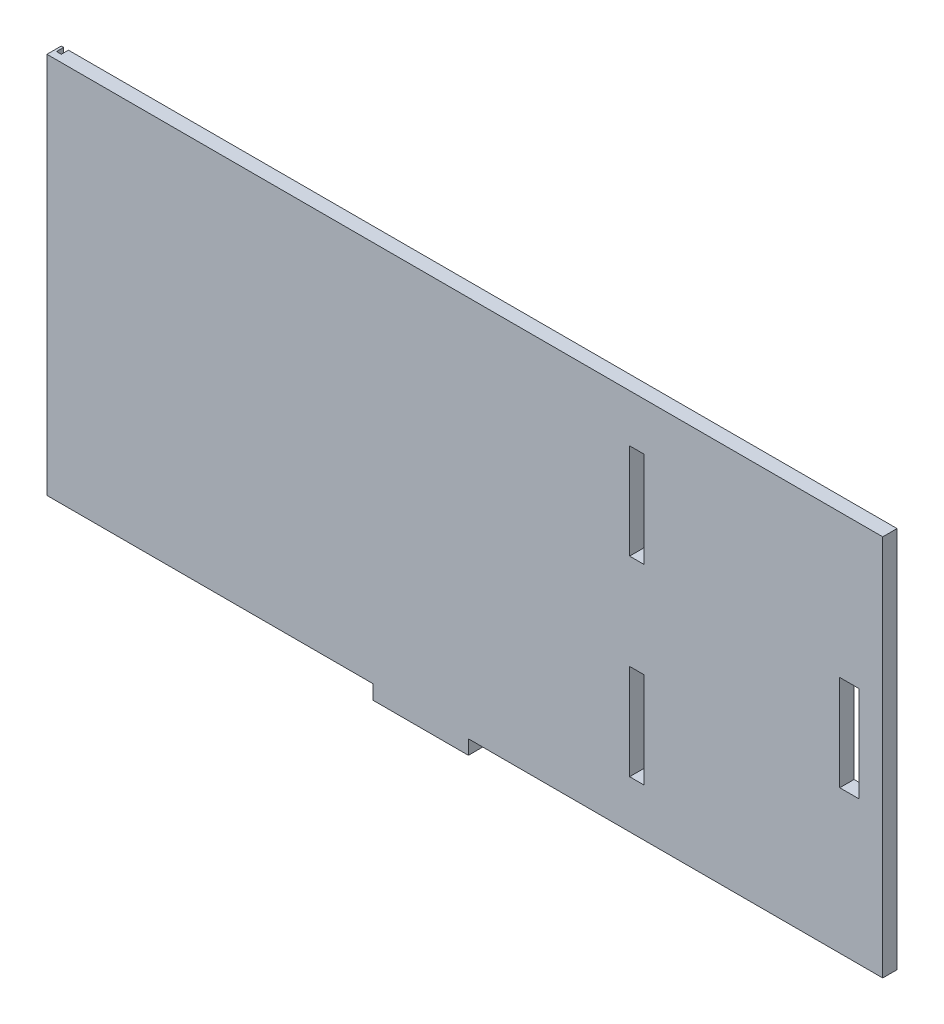
ISO-10303-21;
HEADER;
FILE_DESCRIPTION(('STEP AP214'),'2;1');
FILE_NAME('part.step','',(''),(''),'','','');
FILE_SCHEMA(('AUTOMOTIVE_DESIGN { 1 0 10303 214 1 1 1 1 }'));
ENDSEC;
DATA;
#1=APPLICATION_CONTEXT('core data for automotive mechanical design processes');
#2=APPLICATION_PROTOCOL_DEFINITION('international standard','automotive_design',2000,#1);
#3=PRODUCT_CONTEXT('',#1,'mechanical');
#4=PRODUCT('Part','Part','',(#3));
#5=PRODUCT_RELATED_PRODUCT_CATEGORY('part','',(#4));
#6=PRODUCT_DEFINITION_FORMATION('','',#4);
#7=PRODUCT_DEFINITION_CONTEXT('part definition',#1,'design');
#8=PRODUCT_DEFINITION('design','',#6,#7);
#9=PRODUCT_DEFINITION_SHAPE('','',#8);
#10=(LENGTH_UNIT() NAMED_UNIT(*) SI_UNIT(.MILLI.,.METRE.));
#11=(NAMED_UNIT(*) PLANE_ANGLE_UNIT() SI_UNIT($,.RADIAN.));
#12=(NAMED_UNIT(*) SI_UNIT($,.STERADIAN.) SOLID_ANGLE_UNIT());
#13=UNCERTAINTY_MEASURE_WITH_UNIT(LENGTH_MEASURE(1.E-05),#10,'distance_accuracy_value','');
#14=(GEOMETRIC_REPRESENTATION_CONTEXT(3) GLOBAL_UNCERTAINTY_ASSIGNED_CONTEXT((#13)) GLOBAL_UNIT_ASSIGNED_CONTEXT((#10,
#11,#12)) REPRESENTATION_CONTEXT('',''));
#15=CARTESIAN_POINT('',(0.,0.,0.));
#16=DIRECTION('',(0.,0.,1.));
#17=DIRECTION('',(1.,0.,0.));
#18=AXIS2_PLACEMENT_3D('',#15,#16,#17);
#19=CARTESIAN_POINT('',(0.,-80.,3.));
#20=DIRECTION('',(0.,1.,0.));
#21=DIRECTION('',(0.,0.,1.));
#22=AXIS2_PLACEMENT_3D('',#19,#20,#21);
#23=PLANE('',#22);
#24=DIRECTION('',(0.,0.,1.));
#25=VECTOR('',#24,1.);
#26=CARTESIAN_POINT('',(-86.75,-80.,0.));
#27=LINE('',#26,#25);
#28=CARTESIAN_POINT('',(-86.75,-80.,0.));
#29=VERTEX_POINT('',#28);
#30=CARTESIAN_POINT('',(-86.75,-80.,3.));
#31=VERTEX_POINT('',#30);
#32=EDGE_CURVE('E237',#29,#31,#27,.T.);
#33=ORIENTED_EDGE('',*,*,#32,.F.);
#34=DIRECTION('',(1.,0.,0.));
#35=VECTOR('',#34,1.);
#36=CARTESIAN_POINT('',(0.,-80.,0.));
#37=LINE('',#36,#35);
#38=CARTESIAN_POINT('',(0.,-80.,0.));
#39=VERTEX_POINT('',#38);
#40=EDGE_CURVE('E375',#29,#39,#37,.T.);
#41=ORIENTED_EDGE('',*,*,#40,.T.);
#42=DIRECTION('',(0.,0.,-1.));
#43=VECTOR('',#42,1.);
#44=CARTESIAN_POINT('',(0.,-80.,3.));
#45=LINE('',#44,#43);
#46=CARTESIAN_POINT('',(0.,-80.,3.));
#47=VERTEX_POINT('',#46);
#48=EDGE_CURVE('E366',#47,#39,#45,.T.);
#49=ORIENTED_EDGE('',*,*,#48,.F.);
#50=DIRECTION('',(1.,0.,0.));
#51=VECTOR('',#50,1.);
#52=CARTESIAN_POINT('',(0.,-80.,3.));
#53=LINE('',#52,#51);
#54=EDGE_CURVE('E362',#31,#47,#53,.T.);
#55=ORIENTED_EDGE('',*,*,#54,.F.);
#56=EDGE_LOOP('',(#33,#41,#49,#55));
#57=FACE_BOUND('',#56,.T.);
#58=ADVANCED_FACE('F39',(#57),#23,.F.);
#59=DIRECTION('',(0.,0.,-1.));
#60=VECTOR('',#59,1.);
#61=CARTESIAN_POINT('',(-106.75,-80.,0.));
#62=LINE('',#61,#60);
#63=CARTESIAN_POINT('',(-106.75,-80.,3.));
#64=VERTEX_POINT('',#63);
#65=CARTESIAN_POINT('',(-106.75,-80.,0.));
#66=VERTEX_POINT('',#65);
#67=EDGE_CURVE('E242',#64,#66,#62,.T.);
#68=ORIENTED_EDGE('',*,*,#67,.F.);
#69=CARTESIAN_POINT('',(-175.,-80.,3.));
#70=VERTEX_POINT('',#69);
#71=EDGE_CURVE('E363',#70,#64,#53,.T.);
#72=ORIENTED_EDGE('',*,*,#71,.F.);
#73=DIRECTION('',(0.,0.,-1.));
#74=VECTOR('',#73,1.);
#75=CARTESIAN_POINT('',(-175.,-80.,3.));
#76=LINE('',#75,#74);
#77=CARTESIAN_POINT('',(-175.,-80.,0.));
#78=VERTEX_POINT('',#77);
#79=EDGE_CURVE('E381',#70,#78,#76,.T.);
#80=ORIENTED_EDGE('',*,*,#79,.T.);
#81=CARTESIAN_POINT('',(-174.5,-80.,0.));
#82=VERTEX_POINT('',#81);
#83=EDGE_CURVE('E358',#78,#82,#37,.T.);
#84=ORIENTED_EDGE('',*,*,#83,.T.);
#85=DIRECTION('',(0.,0.,-1.));
#86=VECTOR('',#85,1.);
#87=CARTESIAN_POINT('',(-174.5,-80.,0.));
#88=LINE('',#87,#86);
#89=CARTESIAN_POINT('',(-174.5,-80.,1.5));
#90=VERTEX_POINT('',#89);
#91=EDGE_CURVE('E267',#90,#82,#88,.T.);
#92=ORIENTED_EDGE('',*,*,#91,.F.);
#93=DIRECTION('',(-1.,0.,0.));
#94=VECTOR('',#93,1.);
#95=CARTESIAN_POINT('',(-174.5,-80.,1.5));
#96=LINE('',#95,#94);
#97=CARTESIAN_POINT('',(-173.5,-80.,1.5));
#98=VERTEX_POINT('',#97);
#99=EDGE_CURVE('E280',#98,#90,#96,.T.);
#100=ORIENTED_EDGE('',*,*,#99,.F.);
#101=DIRECTION('',(0.,0.,1.));
#102=VECTOR('',#101,1.);
#103=CARTESIAN_POINT('',(-173.5,-80.,0.));
#104=LINE('',#103,#102);
#105=CARTESIAN_POINT('',(-173.5,-80.,0.));
#106=VERTEX_POINT('',#105);
#107=EDGE_CURVE('E264',#106,#98,#104,.T.);
#108=ORIENTED_EDGE('',*,*,#107,.F.);
#109=EDGE_CURVE('E378',#106,#66,#37,.T.);
#110=ORIENTED_EDGE('',*,*,#109,.T.);
#111=EDGE_LOOP('',(#68,#72,#80,#84,#92,#100,#108,#110));
#112=FACE_BOUND('',#111,.T.);
#113=ADVANCED_FACE('F398',(#112),#23,.F.);
#114=CARTESIAN_POINT('',(0.,0.,0.));
#115=DIRECTION('',(0.,0.,-1.));
#116=DIRECTION('',(-1.,0.,0.));
#117=AXIS2_PLACEMENT_3D('',#114,#115,#116);
#118=PLANE('',#117);
#119=DIRECTION('',(0.,1.,0.));
#120=VECTOR('',#119,1.);
#121=CARTESIAN_POINT('',(-174.5,-80.001,0.));
#122=LINE('',#121,#120);
#123=CARTESIAN_POINT('',(-174.5,0.,0.));
#124=VERTEX_POINT('',#123);
#125=EDGE_CURVE('E278',#82,#124,#122,.T.);
#126=ORIENTED_EDGE('',*,*,#125,.F.);
#127=ORIENTED_EDGE('',*,*,#83,.F.);
#128=DIRECTION('',(0.,-1.,0.));
#129=VECTOR('',#128,1.);
#130=CARTESIAN_POINT('',(-175.,0.,0.));
#131=LINE('',#130,#129);
#132=CARTESIAN_POINT('',(-175.,0.,0.));
#133=VERTEX_POINT('',#132);
#134=EDGE_CURVE('E373',#133,#78,#131,.T.);
#135=ORIENTED_EDGE('',*,*,#134,.F.);
#136=DIRECTION('',(-1.,0.,0.));
#137=VECTOR('',#136,1.);
#138=CARTESIAN_POINT('',(0.,0.,0.));
#139=LINE('',#138,#137);
#140=EDGE_CURVE('E369',#124,#133,#139,.T.);
#141=ORIENTED_EDGE('',*,*,#140,.F.);
#142=EDGE_LOOP('',(#126,#127,#135,#141));
#143=FACE_BOUND('',#142,.T.);
#144=ADVANCED_FACE('F395',(#143),#118,.T.);
#145=CARTESIAN_POINT('',(0.,0.,3.));
#146=DIRECTION('',(-1.,0.,0.));
#147=DIRECTION('',(0.,0.,1.));
#148=AXIS2_PLACEMENT_3D('',#145,#146,#147);
#149=PLANE('',#148);
#150=DIRECTION('',(0.,1.,0.));
#151=VECTOR('',#150,1.);
#152=CARTESIAN_POINT('',(0.,0.,0.));
#153=LINE('',#152,#151);
#154=CARTESIAN_POINT('',(0.,0.,0.));
#155=VERTEX_POINT('',#154);
#156=EDGE_CURVE('E323',#39,#155,#153,.T.);
#157=ORIENTED_EDGE('',*,*,#156,.T.);
#158=DIRECTION('',(0.,0.,-1.));
#159=VECTOR('',#158,1.);
#160=CARTESIAN_POINT('',(0.,0.,3.));
#161=LINE('',#160,#159);
#162=CARTESIAN_POINT('',(0.,0.,3.));
#163=VERTEX_POINT('',#162);
#164=EDGE_CURVE('E11',#163,#155,#161,.T.);
#165=ORIENTED_EDGE('',*,*,#164,.F.);
#166=DIRECTION('',(0.,1.,0.));
#167=VECTOR('',#166,1.);
#168=CARTESIAN_POINT('',(0.,0.,3.));
#169=LINE('',#168,#167);
#170=EDGE_CURVE('E354',#47,#163,#169,.T.);
#171=ORIENTED_EDGE('',*,*,#170,.F.);
#172=ORIENTED_EDGE('',*,*,#48,.T.);
#173=EDGE_LOOP('',(#157,#165,#171,#172));
#174=FACE_BOUND('',#173,.T.);
#175=ADVANCED_FACE('F41',(#174),#149,.F.);
#176=CARTESIAN_POINT('',(0.,0.,3.));
#177=DIRECTION('',(0.,-1.,0.));
#178=DIRECTION('',(0.,0.,-1.));
#179=AXIS2_PLACEMENT_3D('',#176,#177,#178);
#180=PLANE('',#179);
#181=DIRECTION('',(1.,0.,0.));
#182=VECTOR('',#181,1.);
#183=CARTESIAN_POINT('',(-174.5,0.,1.5));
#184=LINE('',#183,#182);
#185=CARTESIAN_POINT('',(-174.5,0.,1.5));
#186=VERTEX_POINT('',#185);
#187=CARTESIAN_POINT('',(-173.5,0.,1.5));
#188=VERTEX_POINT('',#187);
#189=EDGE_CURVE('E272',#186,#188,#184,.T.);
#190=ORIENTED_EDGE('',*,*,#189,.F.);
#191=DIRECTION('',(0.,0.,1.));
#192=VECTOR('',#191,1.);
#193=CARTESIAN_POINT('',(-174.5,0.,0.));
#194=LINE('',#193,#192);
#195=EDGE_CURVE('E269',#124,#186,#194,.T.);
#196=ORIENTED_EDGE('',*,*,#195,.F.);
#197=ORIENTED_EDGE('',*,*,#140,.T.);
#198=DIRECTION('',(0.,0.,-1.));
#199=VECTOR('',#198,1.);
#200=CARTESIAN_POINT('',(-175.,0.,3.));
#201=LINE('',#200,#199);
#202=CARTESIAN_POINT('',(-175.,0.,3.));
#203=VERTEX_POINT('',#202);
#204=EDGE_CURVE('E47',#203,#133,#201,.T.);
#205=ORIENTED_EDGE('',*,*,#204,.F.);
#206=DIRECTION('',(-1.,0.,0.));
#207=VECTOR('',#206,1.);
#208=CARTESIAN_POINT('',(0.,0.,3.));
#209=LINE('',#208,#207);
#210=EDGE_CURVE('E357',#163,#203,#209,.T.);
#211=ORIENTED_EDGE('',*,*,#210,.F.);
#212=ORIENTED_EDGE('',*,*,#164,.T.);
#213=CARTESIAN_POINT('',(-173.5,0.,0.));
#214=VERTEX_POINT('',#213);
#215=EDGE_CURVE('E370',#155,#214,#139,.T.);
#216=ORIENTED_EDGE('',*,*,#215,.T.);
#217=DIRECTION('',(0.,0.,-1.));
#218=VECTOR('',#217,1.);
#219=CARTESIAN_POINT('',(-173.5,0.,0.));
#220=LINE('',#219,#218);
#221=EDGE_CURVE('E275',#188,#214,#220,.T.);
#222=ORIENTED_EDGE('',*,*,#221,.F.);
#223=EDGE_LOOP('',(#190,#196,#197,#205,#211,#212,#216,#222));
#224=FACE_BOUND('',#223,.T.);
#225=ADVANCED_FACE('F426',(#224),#180,.F.);
#226=CARTESIAN_POINT('',(-175.,0.,3.));
#227=DIRECTION('',(1.,0.,0.));
#228=DIRECTION('',(0.,0.,-1.));
#229=AXIS2_PLACEMENT_3D('',#226,#227,#228);
#230=PLANE('',#229);
#231=ORIENTED_EDGE('',*,*,#134,.T.);
#232=ORIENTED_EDGE('',*,*,#79,.F.);
#233=DIRECTION('',(0.,-1.,0.));
#234=VECTOR('',#233,1.);
#235=CARTESIAN_POINT('',(-175.,0.,3.));
#236=LINE('',#235,#234);
#237=EDGE_CURVE('E360',#203,#70,#236,.T.);
#238=ORIENTED_EDGE('',*,*,#237,.F.);
#239=ORIENTED_EDGE('',*,*,#204,.T.);
#240=EDGE_LOOP('',(#231,#232,#238,#239));
#241=FACE_BOUND('',#240,.T.);
#242=ADVANCED_FACE('F388',(#241),#230,.F.);
#243=CARTESIAN_POINT('',(0.,0.,3.));
#244=DIRECTION('',(0.,0.,-1.));
#245=DIRECTION('',(-1.,0.,0.));
#246=AXIS2_PLACEMENT_3D('',#243,#244,#245);
#247=PLANE('',#246);
#248=DIRECTION('',(1.,0.,0.));
#249=VECTOR('',#248,1.);
#250=CARTESIAN_POINT('',(0.,-30.,3.));
#251=LINE('',#250,#249);
#252=CARTESIAN_POINT('',(-9.,-30.,3.));
#253=VERTEX_POINT('',#252);
#254=CARTESIAN_POINT('',(-5.,-30.,3.));
#255=VERTEX_POINT('',#254);
#256=EDGE_CURVE('E231',#253,#255,#251,.T.);
#257=ORIENTED_EDGE('',*,*,#256,.T.);
#258=DIRECTION('',(0.,-1.,0.));
#259=VECTOR('',#258,1.);
#260=CARTESIAN_POINT('',(-5.,0.,3.));
#261=LINE('',#260,#259);
#262=CARTESIAN_POINT('',(-5.,-50.,3.));
#263=VERTEX_POINT('',#262);
#264=EDGE_CURVE('E234',#255,#263,#261,.T.);
#265=ORIENTED_EDGE('',*,*,#264,.T.);
#266=DIRECTION('',(-1.,0.,0.));
#267=VECTOR('',#266,1.);
#268=CARTESIAN_POINT('',(0.,-50.,3.));
#269=LINE('',#268,#267);
#270=CARTESIAN_POINT('',(-9.,-50.,3.));
#271=VERTEX_POINT('',#270);
#272=EDGE_CURVE('E226',#263,#271,#269,.T.);
#273=ORIENTED_EDGE('',*,*,#272,.T.);
#274=DIRECTION('',(0.,1.,0.));
#275=VECTOR('',#274,1.);
#276=CARTESIAN_POINT('',(-9.,0.,3.));
#277=LINE('',#276,#275);
#278=EDGE_CURVE('E206',#271,#253,#277,.T.);
#279=ORIENTED_EDGE('',*,*,#278,.T.);
#280=EDGE_LOOP('',(#257,#265,#273,#279));
#281=FACE_BOUND('',#280,.T.);
#282=DIRECTION('',(1.,0.,0.));
#283=VECTOR('',#282,1.);
#284=CARTESIAN_POINT('',(-53.,-30.,3.));
#285=LINE('',#284,#283);
#286=CARTESIAN_POINT('',(-53.,-30.,3.));
#287=VERTEX_POINT('',#286);
#288=CARTESIAN_POINT('',(-50.,-30.,3.));
#289=VERTEX_POINT('',#288);
#290=EDGE_CURVE('E302',#287,#289,#285,.T.);
#291=ORIENTED_EDGE('',*,*,#290,.F.);
#292=DIRECTION('',(0.,-1.,0.));
#293=VECTOR('',#292,1.);
#294=CARTESIAN_POINT('',(-53.,-30.,3.));
#295=LINE('',#294,#293);
#296=CARTESIAN_POINT('',(-53.,-10.,3.));
#297=VERTEX_POINT('',#296);
#298=EDGE_CURVE('E300',#297,#287,#295,.T.);
#299=ORIENTED_EDGE('',*,*,#298,.F.);
#300=DIRECTION('',(-1.,0.,0.));
#301=VECTOR('',#300,1.);
#302=CARTESIAN_POINT('',(-53.,-10.,3.));
#303=LINE('',#302,#301);
#304=CARTESIAN_POINT('',(-50.,-10.,3.));
#305=VERTEX_POINT('',#304);
#306=EDGE_CURVE('E308',#305,#297,#303,.T.);
#307=ORIENTED_EDGE('',*,*,#306,.F.);
#308=DIRECTION('',(0.,1.,0.));
#309=VECTOR('',#308,1.);
#310=CARTESIAN_POINT('',(-50.,-30.,3.));
#311=LINE('',#310,#309);
#312=EDGE_CURVE('E305',#289,#305,#311,.T.);
#313=ORIENTED_EDGE('',*,*,#312,.F.);
#314=EDGE_LOOP('',(#291,#299,#307,#313));
#315=FACE_BOUND('',#314,.T.);
#316=DIRECTION('',(1.,0.,0.));
#317=VECTOR('',#316,1.);
#318=CARTESIAN_POINT('',(-53.,-70.,3.));
#319=LINE('',#318,#317);
#320=CARTESIAN_POINT('',(-53.,-70.,3.));
#321=VERTEX_POINT('',#320);
#322=CARTESIAN_POINT('',(-50.,-70.,3.));
#323=VERTEX_POINT('',#322);
#324=EDGE_CURVE('E341',#321,#323,#319,.T.);
#325=ORIENTED_EDGE('',*,*,#324,.F.);
#326=DIRECTION('',(0.,-1.,0.));
#327=VECTOR('',#326,1.);
#328=CARTESIAN_POINT('',(-53.,-70.,3.));
#329=LINE('',#328,#327);
#330=CARTESIAN_POINT('',(-53.,-50.,3.));
#331=VERTEX_POINT('',#330);
#332=EDGE_CURVE('E344',#331,#321,#329,.T.);
#333=ORIENTED_EDGE('',*,*,#332,.F.);
#334=DIRECTION('',(-1.,0.,0.));
#335=VECTOR('',#334,1.);
#336=CARTESIAN_POINT('',(-53.,-50.,3.));
#337=LINE('',#336,#335);
#338=CARTESIAN_POINT('',(-50.,-50.,3.));
#339=VERTEX_POINT('',#338);
#340=EDGE_CURVE('E330',#339,#331,#337,.T.);
#341=ORIENTED_EDGE('',*,*,#340,.F.);
#342=DIRECTION('',(0.,1.,0.));
#343=VECTOR('',#342,1.);
#344=CARTESIAN_POINT('',(-50.,-70.,3.));
#345=LINE('',#344,#343);
#346=EDGE_CURVE('E338',#323,#339,#345,.T.);
#347=ORIENTED_EDGE('',*,*,#346,.F.);
#348=EDGE_LOOP('',(#325,#333,#341,#347));
#349=FACE_BOUND('',#348,.T.);
#350=ORIENTED_EDGE('',*,*,#170,.T.);
#351=ORIENTED_EDGE('',*,*,#210,.T.);
#352=ORIENTED_EDGE('',*,*,#237,.T.);
#353=ORIENTED_EDGE('',*,*,#71,.T.);
#354=DIRECTION('',(0.,1.,0.));
#355=VECTOR('',#354,1.);
#356=CARTESIAN_POINT('',(-106.75,-83.,3.));
#357=LINE('',#356,#355);
#358=CARTESIAN_POINT('',(-106.75,-83.,3.));
#359=VERTEX_POINT('',#358);
#360=EDGE_CURVE('E258',#359,#64,#357,.T.);
#361=ORIENTED_EDGE('',*,*,#360,.F.);
#362=DIRECTION('',(-1.,0.,0.));
#363=VECTOR('',#362,1.);
#364=CARTESIAN_POINT('',(-86.75,-83.,3.));
#365=LINE('',#364,#363);
#366=CARTESIAN_POINT('',(-86.75,-83.,3.));
#367=VERTEX_POINT('',#366);
#368=EDGE_CURVE('E241',#367,#359,#365,.T.);
#369=ORIENTED_EDGE('',*,*,#368,.F.);
#370=DIRECTION('',(0.,1.,0.));
#371=VECTOR('',#370,1.);
#372=CARTESIAN_POINT('',(-86.75,-83.,3.));
#373=LINE('',#372,#371);
#374=EDGE_CURVE('E261',#367,#31,#373,.T.);
#375=ORIENTED_EDGE('',*,*,#374,.T.);
#376=ORIENTED_EDGE('',*,*,#54,.T.);
#377=EDGE_LOOP('',(#350,#351,#352,#353,#361,#369,#375,#376));
#378=FACE_BOUND('',#377,.T.);
#379=ADVANCED_FACE('F403',(#281,#315,#349,#378),#247,.F.);
#380=DIRECTION('',(0.,-1.,0.));
#381=VECTOR('',#380,1.);
#382=CARTESIAN_POINT('',(-5.,-30.,0.));
#383=LINE('',#382,#381);
#384=CARTESIAN_POINT('',(-5.,-30.,0.));
#385=VERTEX_POINT('',#384);
#386=CARTESIAN_POINT('',(-5.,-50.,0.));
#387=VERTEX_POINT('',#386);
#388=EDGE_CURVE('E62',#385,#387,#383,.T.);
#389=ORIENTED_EDGE('',*,*,#388,.F.);
#390=DIRECTION('',(1.,0.,0.));
#391=VECTOR('',#390,1.);
#392=CARTESIAN_POINT('',(-5.,-30.,0.));
#393=LINE('',#392,#391);
#394=CARTESIAN_POINT('',(-9.,-30.,0.));
#395=VERTEX_POINT('',#394);
#396=EDGE_CURVE('E219',#395,#385,#393,.T.);
#397=ORIENTED_EDGE('',*,*,#396,.F.);
#398=DIRECTION('',(0.,1.,0.));
#399=VECTOR('',#398,1.);
#400=CARTESIAN_POINT('',(-9.,-30.,0.));
#401=LINE('',#400,#399);
#402=CARTESIAN_POINT('',(-9.,-50.,0.));
#403=VERTEX_POINT('',#402);
#404=EDGE_CURVE('E203',#403,#395,#401,.T.);
#405=ORIENTED_EDGE('',*,*,#404,.F.);
#406=DIRECTION('',(-1.,0.,0.));
#407=VECTOR('',#406,1.);
#408=CARTESIAN_POINT('',(-5.,-50.,0.));
#409=LINE('',#408,#407);
#410=EDGE_CURVE('E212',#387,#403,#409,.T.);
#411=ORIENTED_EDGE('',*,*,#410,.F.);
#412=EDGE_LOOP('',(#389,#397,#405,#411));
#413=FACE_BOUND('',#412,.T.);
#414=DIRECTION('',(0.,1.,0.));
#415=VECTOR('',#414,1.);
#416=CARTESIAN_POINT('',(-173.5,-80.001,0.));
#417=LINE('',#416,#415);
#418=EDGE_CURVE('E281',#106,#214,#417,.T.);
#419=ORIENTED_EDGE('',*,*,#418,.T.);
#420=ORIENTED_EDGE('',*,*,#215,.F.);
#421=ORIENTED_EDGE('',*,*,#156,.F.);
#422=ORIENTED_EDGE('',*,*,#40,.F.);
#423=DIRECTION('',(0.,1.,0.));
#424=VECTOR('',#423,1.);
#425=CARTESIAN_POINT('',(-86.75,-83.,0.));
#426=LINE('',#425,#424);
#427=CARTESIAN_POINT('',(-86.75,-83.,0.));
#428=VERTEX_POINT('',#427);
#429=EDGE_CURVE('E248',#428,#29,#426,.T.);
#430=ORIENTED_EDGE('',*,*,#429,.F.);
#431=DIRECTION('',(1.,0.,0.));
#432=VECTOR('',#431,1.);
#433=CARTESIAN_POINT('',(-86.75,-83.,0.));
#434=LINE('',#433,#432);
#435=CARTESIAN_POINT('',(-106.75,-83.,0.));
#436=VERTEX_POINT('',#435);
#437=EDGE_CURVE('E246',#436,#428,#434,.T.);
#438=ORIENTED_EDGE('',*,*,#437,.F.);
#439=DIRECTION('',(0.,1.,0.));
#440=VECTOR('',#439,1.);
#441=CARTESIAN_POINT('',(-106.75,-83.,0.));
#442=LINE('',#441,#440);
#443=EDGE_CURVE('E255',#436,#66,#442,.T.);
#444=ORIENTED_EDGE('',*,*,#443,.T.);
#445=ORIENTED_EDGE('',*,*,#109,.F.);
#446=EDGE_LOOP('',(#419,#420,#421,#422,#430,#438,#444,#445));
#447=FACE_BOUND('',#446,.T.);
#448=DIRECTION('',(0.,-1.,0.));
#449=VECTOR('',#448,1.);
#450=CARTESIAN_POINT('',(-53.,-30.,0.));
#451=LINE('',#450,#449);
#452=CARTESIAN_POINT('',(-53.,-10.,0.));
#453=VERTEX_POINT('',#452);
#454=CARTESIAN_POINT('',(-53.,-30.,0.));
#455=VERTEX_POINT('',#454);
#456=EDGE_CURVE('E297',#453,#455,#451,.T.);
#457=ORIENTED_EDGE('',*,*,#456,.T.);
#458=DIRECTION('',(1.,0.,0.));
#459=VECTOR('',#458,1.);
#460=CARTESIAN_POINT('',(-53.,-30.,0.));
#461=LINE('',#460,#459);
#462=CARTESIAN_POINT('',(-50.,-30.,0.));
#463=VERTEX_POINT('',#462);
#464=EDGE_CURVE('E314',#455,#463,#461,.T.);
#465=ORIENTED_EDGE('',*,*,#464,.T.);
#466=DIRECTION('',(0.,1.,0.));
#467=VECTOR('',#466,1.);
#468=CARTESIAN_POINT('',(-50.,-30.,0.));
#469=LINE('',#468,#467);
#470=CARTESIAN_POINT('',(-50.,-10.,0.));
#471=VERTEX_POINT('',#470);
#472=EDGE_CURVE('E290',#463,#471,#469,.T.);
#473=ORIENTED_EDGE('',*,*,#472,.T.);
#474=DIRECTION('',(-1.,0.,0.));
#475=VECTOR('',#474,1.);
#476=CARTESIAN_POINT('',(-53.,-10.,0.));
#477=LINE('',#476,#475);
#478=EDGE_CURVE('E293',#471,#453,#477,.T.);
#479=ORIENTED_EDGE('',*,*,#478,.T.);
#480=EDGE_LOOP('',(#457,#465,#473,#479));
#481=FACE_BOUND('',#480,.T.);
#482=DIRECTION('',(0.,-1.,0.));
#483=VECTOR('',#482,1.);
#484=CARTESIAN_POINT('',(-53.,-70.,0.));
#485=LINE('',#484,#483);
#486=CARTESIAN_POINT('',(-53.,-50.,0.));
#487=VERTEX_POINT('',#486);
#488=CARTESIAN_POINT('',(-53.,-70.,0.));
#489=VERTEX_POINT('',#488);
#490=EDGE_CURVE('E346',#487,#489,#485,.T.);
#491=ORIENTED_EDGE('',*,*,#490,.T.);
#492=DIRECTION('',(1.,0.,0.));
#493=VECTOR('',#492,1.);
#494=CARTESIAN_POINT('',(-53.,-70.,0.));
#495=LINE('',#494,#493);
#496=CARTESIAN_POINT('',(-50.,-70.,0.));
#497=VERTEX_POINT('',#496);
#498=EDGE_CURVE('E289',#489,#497,#495,.T.);
#499=ORIENTED_EDGE('',*,*,#498,.T.);
#500=DIRECTION('',(0.,1.,0.));
#501=VECTOR('',#500,1.);
#502=CARTESIAN_POINT('',(-50.,-70.,0.));
#503=LINE('',#502,#501);
#504=CARTESIAN_POINT('',(-50.,-50.,0.));
#505=VERTEX_POINT('',#504);
#506=EDGE_CURVE('E294',#497,#505,#503,.T.);
#507=ORIENTED_EDGE('',*,*,#506,.T.);
#508=DIRECTION('',(-1.,0.,0.));
#509=VECTOR('',#508,1.);
#510=CARTESIAN_POINT('',(-53.,-50.,0.));
#511=LINE('',#510,#509);
#512=EDGE_CURVE('E349',#505,#487,#511,.T.);
#513=ORIENTED_EDGE('',*,*,#512,.T.);
#514=EDGE_LOOP('',(#491,#499,#507,#513));
#515=FACE_BOUND('',#514,.T.);
#516=ADVANCED_FACE('F216',(#413,#447,#481,#515),#118,.T.);
#517=CARTESIAN_POINT('',(-53.,-70.,-0.00100000000000013));
#518=DIRECTION('',(-1.,0.,0.));
#519=DIRECTION('',(0.,0.,1.));
#520=AXIS2_PLACEMENT_3D('',#517,#518,#519);
#521=PLANE('',#520);
#522=DIRECTION('',(0.,0.,1.));
#523=VECTOR('',#522,1.);
#524=CARTESIAN_POINT('',(-53.,-50.,-0.00100000000000013));
#525=LINE('',#524,#523);
#526=EDGE_CURVE('E326',#487,#331,#525,.T.);
#527=ORIENTED_EDGE('',*,*,#526,.T.);
#528=ORIENTED_EDGE('',*,*,#332,.T.);
#529=DIRECTION('',(0.,0.,1.));
#530=VECTOR('',#529,1.);
#531=CARTESIAN_POINT('',(-53.,-70.,-0.00100000000000013));
#532=LINE('',#531,#530);
#533=EDGE_CURVE('E327',#489,#321,#532,.T.);
#534=ORIENTED_EDGE('',*,*,#533,.F.);
#535=ORIENTED_EDGE('',*,*,#490,.F.);
#536=EDGE_LOOP('',(#527,#528,#534,#535));
#537=FACE_BOUND('',#536,.T.);
#538=ADVANCED_FACE('F454',(#537),#521,.F.);
#539=CARTESIAN_POINT('',(-53.,-50.,-0.00100000000000013));
#540=DIRECTION('',(0.,1.,0.));
#541=DIRECTION('',(0.,0.,1.));
#542=AXIS2_PLACEMENT_3D('',#539,#540,#541);
#543=PLANE('',#542);
#544=DIRECTION('',(0.,0.,1.));
#545=VECTOR('',#544,1.);
#546=CARTESIAN_POINT('',(-50.,-50.,-0.00100000000000013));
#547=LINE('',#546,#545);
#548=EDGE_CURVE('E333',#505,#339,#547,.T.);
#549=ORIENTED_EDGE('',*,*,#548,.T.);
#550=ORIENTED_EDGE('',*,*,#340,.T.);
#551=ORIENTED_EDGE('',*,*,#526,.F.);
#552=ORIENTED_EDGE('',*,*,#512,.F.);
#553=EDGE_LOOP('',(#549,#550,#551,#552));
#554=FACE_BOUND('',#553,.T.);
#555=ADVANCED_FACE('F457',(#554),#543,.F.);
#556=CARTESIAN_POINT('',(-50.,-70.,-0.00100000000000013));
#557=DIRECTION('',(1.,0.,0.));
#558=DIRECTION('',(0.,0.,-1.));
#559=AXIS2_PLACEMENT_3D('',#556,#557,#558);
#560=PLANE('',#559);
#561=DIRECTION('',(0.,0.,1.));
#562=VECTOR('',#561,1.);
#563=CARTESIAN_POINT('',(-50.,-70.,-0.00100000000000013));
#564=LINE('',#563,#562);
#565=EDGE_CURVE('E331',#497,#323,#564,.T.);
#566=ORIENTED_EDGE('',*,*,#565,.T.);
#567=ORIENTED_EDGE('',*,*,#346,.T.);
#568=ORIENTED_EDGE('',*,*,#548,.F.);
#569=ORIENTED_EDGE('',*,*,#506,.F.);
#570=EDGE_LOOP('',(#566,#567,#568,#569));
#571=FACE_BOUND('',#570,.T.);
#572=ADVANCED_FACE('F460',(#571),#560,.F.);
#573=CARTESIAN_POINT('',(-53.,-70.,-0.00100000000000013));
#574=DIRECTION('',(0.,-1.,0.));
#575=DIRECTION('',(0.,0.,-1.));
#576=AXIS2_PLACEMENT_3D('',#573,#574,#575);
#577=PLANE('',#576);
#578=ORIENTED_EDGE('',*,*,#533,.T.);
#579=ORIENTED_EDGE('',*,*,#324,.T.);
#580=ORIENTED_EDGE('',*,*,#565,.F.);
#581=ORIENTED_EDGE('',*,*,#498,.F.);
#582=EDGE_LOOP('',(#578,#579,#580,#581));
#583=FACE_BOUND('',#582,.T.);
#584=ADVANCED_FACE('F464',(#583),#577,.F.);
#585=CARTESIAN_POINT('',(-53.,-30.,-0.00100000000000013));
#586=DIRECTION('',(-1.,0.,0.));
#587=DIRECTION('',(0.,0.,1.));
#588=AXIS2_PLACEMENT_3D('',#585,#586,#587);
#589=PLANE('',#588);
#590=DIRECTION('',(0.,0.,1.));
#591=VECTOR('',#590,1.);
#592=CARTESIAN_POINT('',(-53.,-10.,-0.00100000000000013));
#593=LINE('',#592,#591);
#594=EDGE_CURVE('E312',#453,#297,#593,.T.);
#595=ORIENTED_EDGE('',*,*,#594,.T.);
#596=ORIENTED_EDGE('',*,*,#298,.T.);
#597=DIRECTION('',(0.,0.,1.));
#598=VECTOR('',#597,1.);
#599=CARTESIAN_POINT('',(-53.,-30.,-0.00100000000000013));
#600=LINE('',#599,#598);
#601=EDGE_CURVE('E311',#455,#287,#600,.T.);
#602=ORIENTED_EDGE('',*,*,#601,.F.);
#603=ORIENTED_EDGE('',*,*,#456,.F.);
#604=EDGE_LOOP('',(#595,#596,#602,#603));
#605=FACE_BOUND('',#604,.T.);
#606=ADVANCED_FACE('F468',(#605),#589,.F.);
#607=CARTESIAN_POINT('',(-53.,-10.,-0.00100000000000013));
#608=DIRECTION('',(0.,1.,0.));
#609=DIRECTION('',(0.,0.,1.));
#610=AXIS2_PLACEMENT_3D('',#607,#608,#609);
#611=PLANE('',#610);
#612=DIRECTION('',(0.,0.,1.));
#613=VECTOR('',#612,1.);
#614=CARTESIAN_POINT('',(-50.,-10.,-0.00100000000000013));
#615=LINE('',#614,#613);
#616=EDGE_CURVE('E315',#471,#305,#615,.T.);
#617=ORIENTED_EDGE('',*,*,#616,.T.);
#618=ORIENTED_EDGE('',*,*,#306,.T.);
#619=ORIENTED_EDGE('',*,*,#594,.F.);
#620=ORIENTED_EDGE('',*,*,#478,.F.);
#621=EDGE_LOOP('',(#617,#618,#619,#620));
#622=FACE_BOUND('',#621,.T.);
#623=ADVANCED_FACE('F474',(#622),#611,.F.);
#624=CARTESIAN_POINT('',(-50.,-30.,-0.00100000000000013));
#625=DIRECTION('',(1.,0.,0.));
#626=DIRECTION('',(0.,0.,-1.));
#627=AXIS2_PLACEMENT_3D('',#624,#625,#626);
#628=PLANE('',#627);
#629=DIRECTION('',(0.,0.,1.));
#630=VECTOR('',#629,1.);
#631=CARTESIAN_POINT('',(-50.,-30.,-0.00100000000000013));
#632=LINE('',#631,#630);
#633=EDGE_CURVE('E317',#463,#289,#632,.T.);
#634=ORIENTED_EDGE('',*,*,#633,.T.);
#635=ORIENTED_EDGE('',*,*,#312,.T.);
#636=ORIENTED_EDGE('',*,*,#616,.F.);
#637=ORIENTED_EDGE('',*,*,#472,.F.);
#638=EDGE_LOOP('',(#634,#635,#636,#637));
#639=FACE_BOUND('',#638,.T.);
#640=ADVANCED_FACE('F480',(#639),#628,.F.);
#641=CARTESIAN_POINT('',(-53.,-30.,-0.00100000000000013));
#642=DIRECTION('',(0.,-1.,0.));
#643=DIRECTION('',(0.,0.,-1.));
#644=AXIS2_PLACEMENT_3D('',#641,#642,#643);
#645=PLANE('',#644);
#646=ORIENTED_EDGE('',*,*,#601,.T.);
#647=ORIENTED_EDGE('',*,*,#290,.T.);
#648=ORIENTED_EDGE('',*,*,#633,.F.);
#649=ORIENTED_EDGE('',*,*,#464,.F.);
#650=EDGE_LOOP('',(#646,#647,#648,#649));
#651=FACE_BOUND('',#650,.T.);
#652=ADVANCED_FACE('F476',(#651),#645,.F.);
#653=CARTESIAN_POINT('',(-174.5,-80.001,0.));
#654=DIRECTION('',(-1.,0.,0.));
#655=DIRECTION('',(0.,0.,1.));
#656=AXIS2_PLACEMENT_3D('',#653,#654,#655);
#657=PLANE('',#656);
#658=ORIENTED_EDGE('',*,*,#91,.T.);
#659=ORIENTED_EDGE('',*,*,#125,.T.);
#660=ORIENTED_EDGE('',*,*,#195,.T.);
#661=DIRECTION('',(0.,1.,0.));
#662=VECTOR('',#661,1.);
#663=CARTESIAN_POINT('',(-174.5,-80.001,1.5));
#664=LINE('',#663,#662);
#665=EDGE_CURVE('E277',#90,#186,#664,.T.);
#666=ORIENTED_EDGE('',*,*,#665,.F.);
#667=EDGE_LOOP('',(#658,#659,#660,#666));
#668=FACE_BOUND('',#667,.T.);
#669=ADVANCED_FACE('F479',(#668),#657,.F.);
#670=CARTESIAN_POINT('',(-173.5,-80.001,0.));
#671=DIRECTION('',(1.,0.,0.));
#672=DIRECTION('',(0.,0.,-1.));
#673=AXIS2_PLACEMENT_3D('',#670,#671,#672);
#674=PLANE('',#673);
#675=ORIENTED_EDGE('',*,*,#107,.T.);
#676=DIRECTION('',(0.,1.,0.));
#677=VECTOR('',#676,1.);
#678=CARTESIAN_POINT('',(-173.5,-80.001,1.5));
#679=LINE('',#678,#677);
#680=EDGE_CURVE('E284',#98,#188,#679,.T.);
#681=ORIENTED_EDGE('',*,*,#680,.T.);
#682=ORIENTED_EDGE('',*,*,#221,.T.);
#683=ORIENTED_EDGE('',*,*,#418,.F.);
#684=EDGE_LOOP('',(#675,#681,#682,#683));
#685=FACE_BOUND('',#684,.T.);
#686=ADVANCED_FACE('F490',(#685),#674,.F.);
#687=CARTESIAN_POINT('',(-174.5,-80.001,1.5));
#688=DIRECTION('',(0.,0.,1.));
#689=DIRECTION('',(1.,0.,0.));
#690=AXIS2_PLACEMENT_3D('',#687,#688,#689);
#691=PLANE('',#690);
#692=ORIENTED_EDGE('',*,*,#99,.T.);
#693=ORIENTED_EDGE('',*,*,#665,.T.);
#694=ORIENTED_EDGE('',*,*,#189,.T.);
#695=ORIENTED_EDGE('',*,*,#680,.F.);
#696=EDGE_LOOP('',(#692,#693,#694,#695));
#697=FACE_BOUND('',#696,.T.);
#698=ADVANCED_FACE('F492',(#697),#691,.F.);
#699=CARTESIAN_POINT('',(-86.75,-83.,0.));
#700=DIRECTION('',(-1.,0.,0.));
#701=DIRECTION('',(0.,0.,1.));
#702=AXIS2_PLACEMENT_3D('',#699,#700,#701);
#703=PLANE('',#702);
#704=ORIENTED_EDGE('',*,*,#32,.T.);
#705=ORIENTED_EDGE('',*,*,#374,.F.);
#706=DIRECTION('',(0.,0.,1.));
#707=VECTOR('',#706,1.);
#708=CARTESIAN_POINT('',(-86.75,-83.,0.));
#709=LINE('',#708,#707);
#710=EDGE_CURVE('E238',#428,#367,#709,.T.);
#711=ORIENTED_EDGE('',*,*,#710,.F.);
#712=ORIENTED_EDGE('',*,*,#429,.T.);
#713=EDGE_LOOP('',(#704,#705,#711,#712));
#714=FACE_BOUND('',#713,.T.);
#715=ADVANCED_FACE('F416',(#714),#703,.F.);
#716=CARTESIAN_POINT('',(-106.75,-83.,0.));
#717=DIRECTION('',(1.,0.,0.));
#718=DIRECTION('',(0.,0.,-1.));
#719=AXIS2_PLACEMENT_3D('',#716,#717,#718);
#720=PLANE('',#719);
#721=ORIENTED_EDGE('',*,*,#67,.T.);
#722=ORIENTED_EDGE('',*,*,#443,.F.);
#723=DIRECTION('',(0.,0.,-1.));
#724=VECTOR('',#723,1.);
#725=CARTESIAN_POINT('',(-106.75,-83.,0.));
#726=LINE('',#725,#724);
#727=EDGE_CURVE('E244',#359,#436,#726,.T.);
#728=ORIENTED_EDGE('',*,*,#727,.F.);
#729=ORIENTED_EDGE('',*,*,#360,.T.);
#730=EDGE_LOOP('',(#721,#722,#728,#729));
#731=FACE_BOUND('',#730,.T.);
#732=ADVANCED_FACE('F406',(#731),#720,.F.);
#733=CARTESIAN_POINT('',(0.,-83.,0.));
#734=DIRECTION('',(0.,-1.,0.));
#735=DIRECTION('',(0.,0.,-1.));
#736=AXIS2_PLACEMENT_3D('',#733,#734,#735);
#737=PLANE('',#736);
#738=ORIENTED_EDGE('',*,*,#710,.T.);
#739=ORIENTED_EDGE('',*,*,#368,.T.);
#740=ORIENTED_EDGE('',*,*,#727,.T.);
#741=ORIENTED_EDGE('',*,*,#437,.T.);
#742=EDGE_LOOP('',(#738,#739,#740,#741));
#743=FACE_BOUND('',#742,.T.);
#744=ADVANCED_FACE('F410',(#743),#737,.T.);
#745=CARTESIAN_POINT('',(-5.,-30.,10.));
#746=DIRECTION('',(1.,0.,0.));
#747=DIRECTION('',(0.,1.,0.));
#748=AXIS2_PLACEMENT_3D('',#745,#746,#747);
#749=PLANE('',#748);
#750=DIRECTION('',(0.,0.,-1.));
#751=VECTOR('',#750,1.);
#752=CARTESIAN_POINT('',(-5.,-30.,10.));
#753=LINE('',#752,#751);
#754=EDGE_CURVE('E224',#255,#385,#753,.T.);
#755=ORIENTED_EDGE('',*,*,#754,.T.);
#756=ORIENTED_EDGE('',*,*,#388,.T.);
#757=DIRECTION('',(0.,0.,-1.));
#758=VECTOR('',#757,1.);
#759=CARTESIAN_POINT('',(-5.,-50.,10.));
#760=LINE('',#759,#758);
#761=EDGE_CURVE('E209',#263,#387,#760,.T.);
#762=ORIENTED_EDGE('',*,*,#761,.F.);
#763=ORIENTED_EDGE('',*,*,#264,.F.);
#764=EDGE_LOOP('',(#755,#756,#762,#763));
#765=FACE_BOUND('',#764,.T.);
#766=ADVANCED_FACE('F502',(#765),#749,.F.);
#767=CARTESIAN_POINT('',(-5.,-30.,10.));
#768=DIRECTION('',(0.,1.,0.));
#769=DIRECTION('',(0.,0.,1.));
#770=AXIS2_PLACEMENT_3D('',#767,#768,#769);
#771=PLANE('',#770);
#772=DIRECTION('',(0.,0.,-1.));
#773=VECTOR('',#772,1.);
#774=CARTESIAN_POINT('',(-9.,-30.,10.));
#775=LINE('',#774,#773);
#776=EDGE_CURVE('E208',#253,#395,#775,.T.);
#777=ORIENTED_EDGE('',*,*,#776,.T.);
#778=ORIENTED_EDGE('',*,*,#396,.T.);
#779=ORIENTED_EDGE('',*,*,#754,.F.);
#780=ORIENTED_EDGE('',*,*,#256,.F.);
#781=EDGE_LOOP('',(#777,#778,#779,#780));
#782=FACE_BOUND('',#781,.T.);
#783=ADVANCED_FACE('F505',(#782),#771,.F.);
#784=CARTESIAN_POINT('',(-9.,-30.,10.));
#785=DIRECTION('',(-1.,0.,0.));
#786=DIRECTION('',(0.,-1.,0.));
#787=AXIS2_PLACEMENT_3D('',#784,#785,#786);
#788=PLANE('',#787);
#789=DIRECTION('',(0.,0.,-1.));
#790=VECTOR('',#789,1.);
#791=CARTESIAN_POINT('',(-9.,-50.,10.));
#792=LINE('',#791,#790);
#793=EDGE_CURVE('E54',#271,#403,#792,.T.);
#794=ORIENTED_EDGE('',*,*,#793,.T.);
#795=ORIENTED_EDGE('',*,*,#404,.T.);
#796=ORIENTED_EDGE('',*,*,#776,.F.);
#797=ORIENTED_EDGE('',*,*,#278,.F.);
#798=EDGE_LOOP('',(#794,#795,#796,#797));
#799=FACE_BOUND('',#798,.T.);
#800=ADVANCED_FACE('F200',(#799),#788,.F.);
#801=CARTESIAN_POINT('',(-5.,-50.,10.));
#802=DIRECTION('',(0.,-1.,0.));
#803=DIRECTION('',(0.,0.,-1.));
#804=AXIS2_PLACEMENT_3D('',#801,#802,#803);
#805=PLANE('',#804);
#806=ORIENTED_EDGE('',*,*,#761,.T.);
#807=ORIENTED_EDGE('',*,*,#410,.T.);
#808=ORIENTED_EDGE('',*,*,#793,.F.);
#809=ORIENTED_EDGE('',*,*,#272,.F.);
#810=EDGE_LOOP('',(#806,#807,#808,#809));
#811=FACE_BOUND('',#810,.T.);
#812=ADVANCED_FACE('F213',(#811),#805,.F.);
#813=CLOSED_SHELL('',(#58,#113,#144,#175,#225,#242,#379,#516,#538,#555,#572,#584,#606,#623,#640,
#652,#669,#686,#698,#715,#732,#744,#766,#783,#800,#812));
#814=MANIFOLD_SOLID_BREP('B2',#813);
#815=ADVANCED_BREP_SHAPE_REPRESENTATION('',(#18,#814),#14);
#816=SHAPE_DEFINITION_REPRESENTATION(#9,#815);
ENDSEC;
END-ISO-10303-21;
